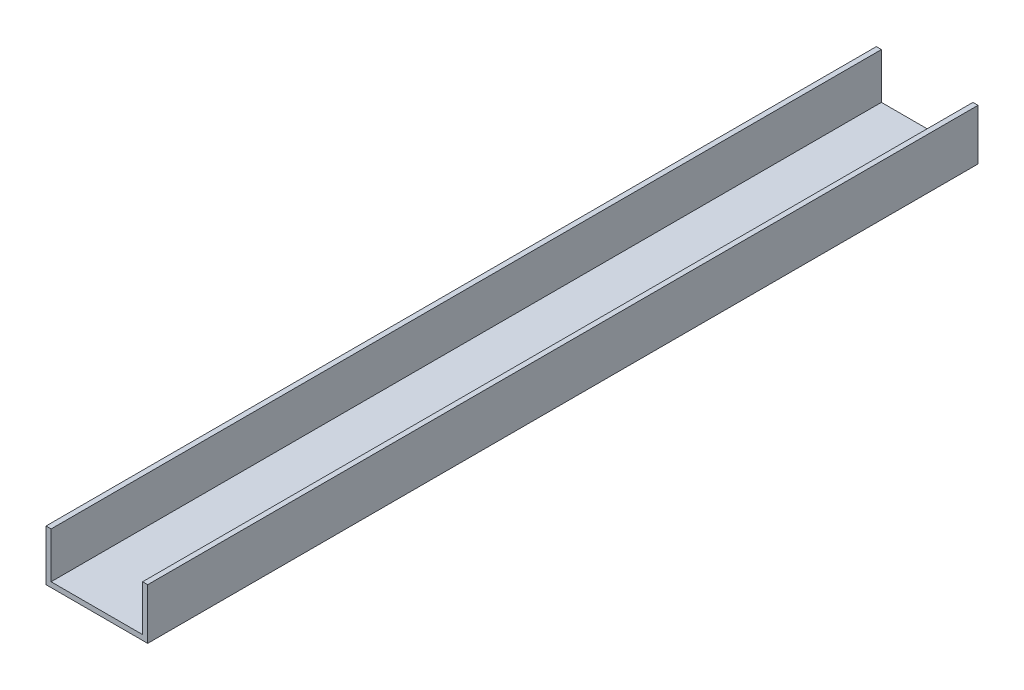
ISO-10303-21;
HEADER;
FILE_DESCRIPTION(('STEP AP214'),'2;1');
FILE_NAME('part.step','',(''),(''),'','','');
FILE_SCHEMA(('AUTOMOTIVE_DESIGN { 1 0 10303 214 1 1 1 1 }'));
ENDSEC;
DATA;
#1=APPLICATION_CONTEXT('core data for automotive mechanical design processes');
#2=APPLICATION_PROTOCOL_DEFINITION('international standard','automotive_design',2000,#1);
#3=PRODUCT_CONTEXT('',#1,'mechanical');
#4=PRODUCT('Part','Part','',(#3));
#5=PRODUCT_RELATED_PRODUCT_CATEGORY('part','',(#4));
#6=PRODUCT_DEFINITION_FORMATION('','',#4);
#7=PRODUCT_DEFINITION_CONTEXT('part definition',#1,'design');
#8=PRODUCT_DEFINITION('design','',#6,#7);
#9=PRODUCT_DEFINITION_SHAPE('','',#8);
#10=(LENGTH_UNIT() NAMED_UNIT(*) SI_UNIT(.MILLI.,.METRE.));
#11=(NAMED_UNIT(*) PLANE_ANGLE_UNIT() SI_UNIT($,.RADIAN.));
#12=(NAMED_UNIT(*) SI_UNIT($,.STERADIAN.) SOLID_ANGLE_UNIT());
#13=UNCERTAINTY_MEASURE_WITH_UNIT(LENGTH_MEASURE(1.E-05),#10,'distance_accuracy_value','');
#14=(GEOMETRIC_REPRESENTATION_CONTEXT(3) GLOBAL_UNCERTAINTY_ASSIGNED_CONTEXT((#13)) GLOBAL_UNIT_ASSIGNED_CONTEXT((#10,
#11,#12)) REPRESENTATION_CONTEXT('',''));
#15=CARTESIAN_POINT('',(0.,0.,0.));
#16=DIRECTION('',(0.,0.,1.));
#17=DIRECTION('',(1.,0.,0.));
#18=AXIS2_PLACEMENT_3D('',#15,#16,#17);
#19=CARTESIAN_POINT('',(-22.9867221873036,26.6860465116279,490.));
#20=DIRECTION('',(1.,0.,0.));
#21=DIRECTION('',(0.,0.,-1.));
#22=AXIS2_PLACEMENT_3D('',#19,#20,#21);
#23=PLANE('',#22);
#24=DIRECTION('',(0.,-1.,0.));
#25=VECTOR('',#24,1.);
#26=CARTESIAN_POINT('',(-22.9867221873036,26.6860465116279,0.));
#27=LINE('',#26,#25);
#28=CARTESIAN_POINT('',(-22.9867221873036,26.6860465116279,0.));
#29=VERTEX_POINT('',#28);
#30=CARTESIAN_POINT('',(-22.9867221873036,-3.31395348837209,0.));
#31=VERTEX_POINT('',#30);
#32=EDGE_CURVE('E140',#29,#31,#27,.T.);
#33=ORIENTED_EDGE('',*,*,#32,.T.);
#34=DIRECTION('',(0.,0.,-1.));
#35=VECTOR('',#34,1.);
#36=CARTESIAN_POINT('',(-22.9867221873036,-3.31395348837209,490.));
#37=LINE('',#36,#35);
#38=CARTESIAN_POINT('',(-22.9867221873036,-3.31395348837209,490.));
#39=VERTEX_POINT('',#38);
#40=EDGE_CURVE('E11',#39,#31,#37,.T.);
#41=ORIENTED_EDGE('',*,*,#40,.F.);
#42=DIRECTION('',(0.,-1.,0.));
#43=VECTOR('',#42,1.);
#44=CARTESIAN_POINT('',(-22.9867221873036,26.6860465116279,490.));
#45=LINE('',#44,#43);
#46=CARTESIAN_POINT('',(-22.9867221873036,26.6860465116279,490.));
#47=VERTEX_POINT('',#46);
#48=EDGE_CURVE('E162',#47,#39,#45,.T.);
#49=ORIENTED_EDGE('',*,*,#48,.F.);
#50=DIRECTION('',(0.,0.,-1.));
#51=VECTOR('',#50,1.);
#52=CARTESIAN_POINT('',(-22.9867221873036,26.6860465116279,490.));
#53=LINE('',#52,#51);
#54=EDGE_CURVE('E136',#47,#29,#53,.T.);
#55=ORIENTED_EDGE('',*,*,#54,.T.);
#56=EDGE_LOOP('',(#33,#41,#49,#55));
#57=FACE_BOUND('',#56,.T.);
#58=ADVANCED_FACE('F39',(#57),#23,.F.);
#59=CARTESIAN_POINT('',(-22.9867221873036,-3.31395348837209,490.));
#60=DIRECTION('',(0.,1.,0.));
#61=DIRECTION('',(0.,0.,1.));
#62=AXIS2_PLACEMENT_3D('',#59,#60,#61);
#63=PLANE('',#62);
#64=DIRECTION('',(1.,0.,0.));
#65=VECTOR('',#64,1.);
#66=CARTESIAN_POINT('',(-22.9867221873036,-3.31395348837209,0.));
#67=LINE('',#66,#65);
#68=CARTESIAN_POINT('',(37.0132778126964,-3.31395348837209,0.));
#69=VERTEX_POINT('',#68);
#70=EDGE_CURVE('E144',#31,#69,#67,.T.);
#71=ORIENTED_EDGE('',*,*,#70,.T.);
#72=DIRECTION('',(0.,0.,-1.));
#73=VECTOR('',#72,1.);
#74=CARTESIAN_POINT('',(37.0132778126964,-3.31395348837209,490.));
#75=LINE('',#74,#73);
#76=CARTESIAN_POINT('',(37.0132778126964,-3.31395348837209,490.));
#77=VERTEX_POINT('',#76);
#78=EDGE_CURVE('E48',#77,#69,#75,.T.);
#79=ORIENTED_EDGE('',*,*,#78,.F.);
#80=DIRECTION('',(1.,0.,0.));
#81=VECTOR('',#80,1.);
#82=CARTESIAN_POINT('',(-22.9867221873036,-3.31395348837209,490.));
#83=LINE('',#82,#81);
#84=EDGE_CURVE('E99',#39,#77,#83,.T.);
#85=ORIENTED_EDGE('',*,*,#84,.F.);
#86=ORIENTED_EDGE('',*,*,#40,.T.);
#87=EDGE_LOOP('',(#71,#79,#85,#86));
#88=FACE_BOUND('',#87,.T.);
#89=ADVANCED_FACE('F208',(#88),#63,.F.);
#90=CARTESIAN_POINT('',(37.0132778126964,-3.31395348837209,490.));
#91=DIRECTION('',(-1.,0.,0.));
#92=DIRECTION('',(0.,0.,1.));
#93=AXIS2_PLACEMENT_3D('',#90,#91,#92);
#94=PLANE('',#93);
#95=DIRECTION('',(0.,1.,0.));
#96=VECTOR('',#95,1.);
#97=CARTESIAN_POINT('',(37.0132778126964,-3.31395348837209,0.));
#98=LINE('',#97,#96);
#99=CARTESIAN_POINT('',(37.0132778126964,26.6860465116279,0.));
#100=VERTEX_POINT('',#99);
#101=EDGE_CURVE('E147',#69,#100,#98,.T.);
#102=ORIENTED_EDGE('',*,*,#101,.T.);
#103=DIRECTION('',(0.,0.,-1.));
#104=VECTOR('',#103,1.);
#105=CARTESIAN_POINT('',(37.0132778126964,26.6860465116279,490.));
#106=LINE('',#105,#104);
#107=CARTESIAN_POINT('',(37.0132778126964,26.6860465116279,490.));
#108=VERTEX_POINT('',#107);
#109=EDGE_CURVE('E173',#108,#100,#106,.T.);
#110=ORIENTED_EDGE('',*,*,#109,.F.);
#111=DIRECTION('',(0.,1.,0.));
#112=VECTOR('',#111,1.);
#113=CARTESIAN_POINT('',(37.0132778126964,-3.31395348837209,490.));
#114=LINE('',#113,#112);
#115=EDGE_CURVE('E183',#77,#108,#114,.T.);
#116=ORIENTED_EDGE('',*,*,#115,.F.);
#117=ORIENTED_EDGE('',*,*,#78,.T.);
#118=EDGE_LOOP('',(#102,#110,#116,#117));
#119=FACE_BOUND('',#118,.T.);
#120=ADVANCED_FACE('F181',(#119),#94,.F.);
#121=CARTESIAN_POINT('',(37.0132778126964,26.6860465116279,490.));
#122=DIRECTION('',(0.,-1.,0.));
#123=DIRECTION('',(0.,0.,-1.));
#124=AXIS2_PLACEMENT_3D('',#121,#122,#123);
#125=PLANE('',#124);
#126=DIRECTION('',(-1.,0.,0.));
#127=VECTOR('',#126,1.);
#128=CARTESIAN_POINT('',(37.0132778126964,26.6860465116279,0.));
#129=LINE('',#128,#127);
#130=CARTESIAN_POINT('',(34.0132778126964,26.6860465116279,0.));
#131=VERTEX_POINT('',#130);
#132=EDGE_CURVE('E150',#100,#131,#129,.T.);
#133=ORIENTED_EDGE('',*,*,#132,.T.);
#134=DIRECTION('',(0.,0.,-1.));
#135=VECTOR('',#134,1.);
#136=CARTESIAN_POINT('',(34.0132778126964,26.6860465116279,490.));
#137=LINE('',#136,#135);
#138=CARTESIAN_POINT('',(34.0132778126964,26.6860465116279,490.));
#139=VERTEX_POINT('',#138);
#140=EDGE_CURVE('E169',#139,#131,#137,.T.);
#141=ORIENTED_EDGE('',*,*,#140,.F.);
#142=DIRECTION('',(-1.,0.,0.));
#143=VECTOR('',#142,1.);
#144=CARTESIAN_POINT('',(37.0132778126964,26.6860465116279,490.));
#145=LINE('',#144,#143);
#146=EDGE_CURVE('E196',#108,#139,#145,.T.);
#147=ORIENTED_EDGE('',*,*,#146,.F.);
#148=ORIENTED_EDGE('',*,*,#109,.T.);
#149=EDGE_LOOP('',(#133,#141,#147,#148));
#150=FACE_BOUND('',#149,.T.);
#151=ADVANCED_FACE('F191',(#150),#125,.F.);
#152=CARTESIAN_POINT('',(34.0132778126964,26.6860465116279,490.));
#153=DIRECTION('',(1.,0.,0.));
#154=DIRECTION('',(0.,1.,0.));
#155=AXIS2_PLACEMENT_3D('',#152,#153,#154);
#156=PLANE('',#155);
#157=DIRECTION('',(0.,-1.,0.));
#158=VECTOR('',#157,1.);
#159=CARTESIAN_POINT('',(34.0132778126964,26.6860465116279,0.));
#160=LINE('',#159,#158);
#161=CARTESIAN_POINT('',(34.0132778126964,-0.313953488372095,0.));
#162=VERTEX_POINT('',#161);
#163=EDGE_CURVE('E153',#131,#162,#160,.T.);
#164=ORIENTED_EDGE('',*,*,#163,.T.);
#165=DIRECTION('',(0.,0.,-1.));
#166=VECTOR('',#165,1.);
#167=CARTESIAN_POINT('',(34.0132778126964,-0.313953488372095,490.));
#168=LINE('',#167,#166);
#169=CARTESIAN_POINT('',(34.0132778126964,-0.313953488372095,490.));
#170=VERTEX_POINT('',#169);
#171=EDGE_CURVE('E129',#170,#162,#168,.T.);
#172=ORIENTED_EDGE('',*,*,#171,.F.);
#173=DIRECTION('',(0.,-1.,0.));
#174=VECTOR('',#173,1.);
#175=CARTESIAN_POINT('',(34.0132778126964,26.6860465116279,490.));
#176=LINE('',#175,#174);
#177=EDGE_CURVE('E118',#139,#170,#176,.T.);
#178=ORIENTED_EDGE('',*,*,#177,.F.);
#179=ORIENTED_EDGE('',*,*,#140,.T.);
#180=EDGE_LOOP('',(#164,#172,#178,#179));
#181=FACE_BOUND('',#180,.T.);
#182=ADVANCED_FACE('F194',(#181),#156,.F.);
#183=CARTESIAN_POINT('',(34.0132778126964,-0.313953488372095,490.));
#184=DIRECTION('',(0.,-1.,0.));
#185=DIRECTION('',(1.,0.,0.));
#186=AXIS2_PLACEMENT_3D('',#183,#184,#185);
#187=PLANE('',#186);
#188=DIRECTION('',(-1.,0.,0.));
#189=VECTOR('',#188,1.);
#190=CARTESIAN_POINT('',(34.0132778126964,-0.313953488372095,0.));
#191=LINE('',#190,#189);
#192=CARTESIAN_POINT('',(-19.9867221873036,-0.313953488372102,0.));
#193=VERTEX_POINT('',#192);
#194=EDGE_CURVE('E127',#162,#193,#191,.T.);
#195=ORIENTED_EDGE('',*,*,#194,.T.);
#196=DIRECTION('',(0.,0.,-1.));
#197=VECTOR('',#196,1.);
#198=CARTESIAN_POINT('',(-19.9867221873036,-0.313953488372102,490.));
#199=LINE('',#198,#197);
#200=CARTESIAN_POINT('',(-19.9867221873036,-0.313953488372102,490.));
#201=VERTEX_POINT('',#200);
#202=EDGE_CURVE('E124',#201,#193,#199,.T.);
#203=ORIENTED_EDGE('',*,*,#202,.F.);
#204=DIRECTION('',(-1.,0.,0.));
#205=VECTOR('',#204,1.);
#206=CARTESIAN_POINT('',(34.0132778126964,-0.313953488372095,490.));
#207=LINE('',#206,#205);
#208=EDGE_CURVE('E112',#170,#201,#207,.T.);
#209=ORIENTED_EDGE('',*,*,#208,.F.);
#210=ORIENTED_EDGE('',*,*,#171,.T.);
#211=EDGE_LOOP('',(#195,#203,#209,#210));
#212=FACE_BOUND('',#211,.T.);
#213=ADVANCED_FACE('F125',(#212),#187,.F.);
#214=CARTESIAN_POINT('',(-19.9867221873036,-0.313953488372102,490.));
#215=DIRECTION('',(-1.,0.,0.));
#216=DIRECTION('',(0.,0.,1.));
#217=AXIS2_PLACEMENT_3D('',#214,#215,#216);
#218=PLANE('',#217);
#219=DIRECTION('',(0.,1.,0.));
#220=VECTOR('',#219,1.);
#221=CARTESIAN_POINT('',(-19.9867221873036,-0.313953488372102,0.));
#222=LINE('',#221,#220);
#223=CARTESIAN_POINT('',(-19.9867221873036,26.6860465116279,0.));
#224=VERTEX_POINT('',#223);
#225=EDGE_CURVE('E85',#193,#224,#222,.T.);
#226=ORIENTED_EDGE('',*,*,#225,.T.);
#227=DIRECTION('',(0.,0.,-1.));
#228=VECTOR('',#227,1.);
#229=CARTESIAN_POINT('',(-19.9867221873036,26.6860465116279,490.));
#230=LINE('',#229,#228);
#231=CARTESIAN_POINT('',(-19.9867221873036,26.6860465116279,490.));
#232=VERTEX_POINT('',#231);
#233=EDGE_CURVE('E130',#232,#224,#230,.T.);
#234=ORIENTED_EDGE('',*,*,#233,.F.);
#235=DIRECTION('',(0.,1.,0.));
#236=VECTOR('',#235,1.);
#237=CARTESIAN_POINT('',(-19.9867221873036,-0.313953488372102,490.));
#238=LINE('',#237,#236);
#239=EDGE_CURVE('E116',#201,#232,#238,.T.);
#240=ORIENTED_EDGE('',*,*,#239,.F.);
#241=ORIENTED_EDGE('',*,*,#202,.T.);
#242=EDGE_LOOP('',(#226,#234,#240,#241));
#243=FACE_BOUND('',#242,.T.);
#244=ADVANCED_FACE('F132',(#243),#218,.F.);
#245=CARTESIAN_POINT('',(-19.9867221873036,26.6860465116279,490.));
#246=DIRECTION('',(0.,-1.,0.));
#247=DIRECTION('',(1.,0.,0.));
#248=AXIS2_PLACEMENT_3D('',#245,#246,#247);
#249=PLANE('',#248);
#250=DIRECTION('',(-1.,0.,0.));
#251=VECTOR('',#250,1.);
#252=CARTESIAN_POINT('',(-19.9867221873036,26.6860465116279,0.));
#253=LINE('',#252,#251);
#254=EDGE_CURVE('E91',#224,#29,#253,.T.);
#255=ORIENTED_EDGE('',*,*,#254,.T.);
#256=ORIENTED_EDGE('',*,*,#54,.F.);
#257=DIRECTION('',(-1.,0.,0.));
#258=VECTOR('',#257,1.);
#259=CARTESIAN_POINT('',(-19.9867221873036,26.6860465116279,490.));
#260=LINE('',#259,#258);
#261=EDGE_CURVE('E56',#232,#47,#260,.T.);
#262=ORIENTED_EDGE('',*,*,#261,.F.);
#263=ORIENTED_EDGE('',*,*,#233,.T.);
#264=EDGE_LOOP('',(#255,#256,#262,#263));
#265=FACE_BOUND('',#264,.T.);
#266=ADVANCED_FACE('F224',(#265),#249,.F.);
#267=CARTESIAN_POINT('',(0.,0.,490.));
#268=DIRECTION('',(0.,0.,1.));
#269=DIRECTION('',(1.,0.,0.));
#270=AXIS2_PLACEMENT_3D('',#267,#268,#269);
#271=PLANE('',#270);
#272=ORIENTED_EDGE('',*,*,#48,.T.);
#273=ORIENTED_EDGE('',*,*,#84,.T.);
#274=ORIENTED_EDGE('',*,*,#115,.T.);
#275=ORIENTED_EDGE('',*,*,#146,.T.);
#276=ORIENTED_EDGE('',*,*,#177,.T.);
#277=ORIENTED_EDGE('',*,*,#208,.T.);
#278=ORIENTED_EDGE('',*,*,#239,.T.);
#279=ORIENTED_EDGE('',*,*,#261,.T.);
#280=EDGE_LOOP('',(#272,#273,#274,#275,#276,#277,#278,#279));
#281=FACE_BOUND('',#280,.T.);
#282=ADVANCED_FACE('F114',(#281),#271,.T.);
#283=CARTESIAN_POINT('',(0.,0.,0.));
#284=DIRECTION('',(0.,0.,1.));
#285=DIRECTION('',(1.,0.,0.));
#286=AXIS2_PLACEMENT_3D('',#283,#284,#285);
#287=PLANE('',#286);
#288=ORIENTED_EDGE('',*,*,#32,.F.);
#289=ORIENTED_EDGE('',*,*,#254,.F.);
#290=ORIENTED_EDGE('',*,*,#225,.F.);
#291=ORIENTED_EDGE('',*,*,#194,.F.);
#292=ORIENTED_EDGE('',*,*,#163,.F.);
#293=ORIENTED_EDGE('',*,*,#132,.F.);
#294=ORIENTED_EDGE('',*,*,#101,.F.);
#295=ORIENTED_EDGE('',*,*,#70,.F.);
#296=EDGE_LOOP('',(#288,#289,#290,#291,#292,#293,#294,#295));
#297=FACE_BOUND('',#296,.T.);
#298=ADVANCED_FACE('F187',(#297),#287,.F.);
#299=CLOSED_SHELL('',(#58,#89,#120,#151,#182,#213,#244,#266,#282,#298));
#300=MANIFOLD_SOLID_BREP('B2',#299);
#301=ADVANCED_BREP_SHAPE_REPRESENTATION('',(#18,#300),#14);
#302=SHAPE_DEFINITION_REPRESENTATION(#9,#301);
ENDSEC;
END-ISO-10303-21;
